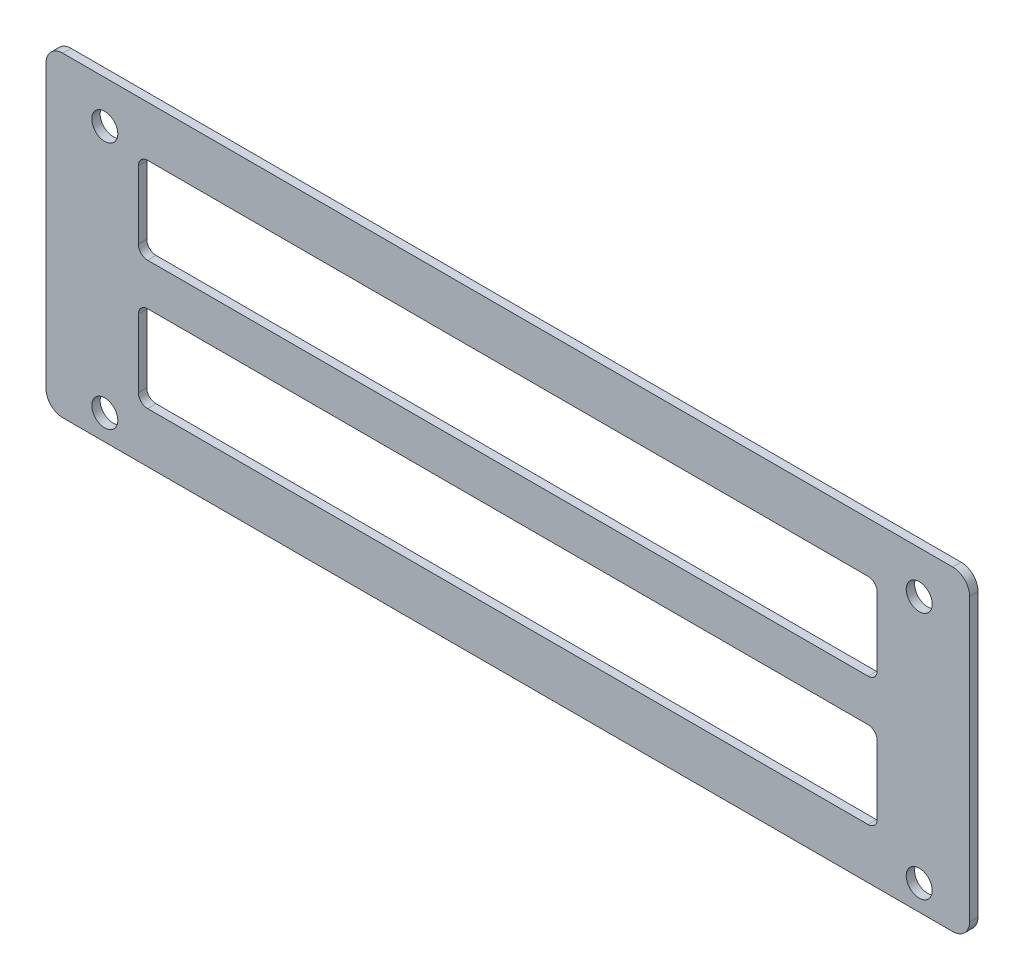
ISO-10303-21;
HEADER;
FILE_DESCRIPTION(('STEP AP214'),'2;1');
FILE_NAME('part.step','',(''),(''),'','','');
FILE_SCHEMA(('AUTOMOTIVE_DESIGN { 1 0 10303 214 1 1 1 1 }'));
ENDSEC;
DATA;
#1=APPLICATION_CONTEXT('core data for automotive mechanical design processes');
#2=APPLICATION_PROTOCOL_DEFINITION('international standard','automotive_design',2000,#1);
#3=PRODUCT_CONTEXT('',#1,'mechanical');
#4=PRODUCT('Part','Part','',(#3));
#5=PRODUCT_RELATED_PRODUCT_CATEGORY('part','',(#4));
#6=PRODUCT_DEFINITION_FORMATION('','',#4);
#7=PRODUCT_DEFINITION_CONTEXT('part definition',#1,'design');
#8=PRODUCT_DEFINITION('design','',#6,#7);
#9=PRODUCT_DEFINITION_SHAPE('','',#8);
#10=(LENGTH_UNIT() NAMED_UNIT(*) SI_UNIT(.MILLI.,.METRE.));
#11=(NAMED_UNIT(*) PLANE_ANGLE_UNIT() SI_UNIT($,.RADIAN.));
#12=(NAMED_UNIT(*) SI_UNIT($,.STERADIAN.) SOLID_ANGLE_UNIT());
#13=UNCERTAINTY_MEASURE_WITH_UNIT(LENGTH_MEASURE(1.E-05),#10,'distance_accuracy_value','');
#14=(GEOMETRIC_REPRESENTATION_CONTEXT(3) GLOBAL_UNCERTAINTY_ASSIGNED_CONTEXT((#13)) GLOBAL_UNIT_ASSIGNED_CONTEXT((#10,
#11,#12)) REPRESENTATION_CONTEXT('',''));
#15=CARTESIAN_POINT('',(0.,0.,0.));
#16=DIRECTION('',(0.,0.,1.));
#17=DIRECTION('',(1.,0.,0.));
#18=AXIS2_PLACEMENT_3D('',#15,#16,#17);
#19=CARTESIAN_POINT('',(-44.0000000000013,-12.8,-9.));
#20=DIRECTION('',(-1.,0.,0.));
#21=DIRECTION('',(0.,0.,1.));
#22=AXIS2_PLACEMENT_3D('',#19,#20,#21);
#23=PLANE('',#22);
#24=DIRECTION('',(0.,1.,0.));
#25=VECTOR('',#24,1.);
#26=CARTESIAN_POINT('',(-44.0000000000013,0.,0.));
#27=LINE('',#26,#25);
#28=CARTESIAN_POINT('',(-44.0000000000013,3.59999999999999,0.));
#29=VERTEX_POINT('',#28);
#30=CARTESIAN_POINT('',(-44.0000000000013,11.7,0.));
#31=VERTEX_POINT('',#30);
#32=EDGE_CURVE('E275',#29,#31,#27,.T.);
#33=ORIENTED_EDGE('',*,*,#32,.T.);
#34=DIRECTION('',(0.,0.,1.));
#35=VECTOR('',#34,1.);
#36=CARTESIAN_POINT('',(-44.0000000000013,11.7,1.));
#37=LINE('',#36,#35);
#38=CARTESIAN_POINT('',(-44.0000000000013,11.7,1.));
#39=VERTEX_POINT('',#38);
#40=EDGE_CURVE('E533',#31,#39,#37,.T.);
#41=ORIENTED_EDGE('',*,*,#40,.T.);
#42=DIRECTION('',(0.,-1.,0.));
#43=VECTOR('',#42,1.);
#44=CARTESIAN_POINT('',(-44.0000000000013,-12.8,1.));
#45=LINE('',#44,#43);
#46=CARTESIAN_POINT('',(-44.0000000000013,3.59999999999999,1.));
#47=VERTEX_POINT('',#46);
#48=EDGE_CURVE('E449',#39,#47,#45,.T.);
#49=ORIENTED_EDGE('',*,*,#48,.T.);
#50=DIRECTION('',(0.,0.,1.));
#51=VECTOR('',#50,1.);
#52=CARTESIAN_POINT('',(-44.0000000000013,3.59999999999999,-9.));
#53=LINE('',#52,#51);
#54=EDGE_CURVE('E536',#47,#29,#53,.F.);
#55=ORIENTED_EDGE('',*,*,#54,.T.);
#56=EDGE_LOOP('',(#33,#41,#49,#55));
#57=FACE_BOUND('',#56,.T.);
#58=ADVANCED_FACE('F39',(#57),#23,.F.);
#59=CARTESIAN_POINT('',(44.0000000000013,-12.8,-9.));
#60=DIRECTION('',(1.,0.,0.));
#61=DIRECTION('',(0.,0.,-1.));
#62=AXIS2_PLACEMENT_3D('',#59,#60,#61);
#63=PLANE('',#62);
#64=DIRECTION('',(0.,1.,0.));
#65=VECTOR('',#64,1.);
#66=CARTESIAN_POINT('',(44.0000000000013,-12.8,1.));
#67=LINE('',#66,#65);
#68=CARTESIAN_POINT('',(44.0000000000013,3.6,1.));
#69=VERTEX_POINT('',#68);
#70=CARTESIAN_POINT('',(44.0000000000013,11.7,1.));
#71=VERTEX_POINT('',#70);
#72=EDGE_CURVE('E425',#69,#71,#67,.T.);
#73=ORIENTED_EDGE('',*,*,#72,.T.);
#74=DIRECTION('',(0.,0.,1.));
#75=VECTOR('',#74,1.);
#76=CARTESIAN_POINT('',(44.0000000000013,11.7,0.));
#77=LINE('',#76,#75);
#78=CARTESIAN_POINT('',(44.0000000000013,11.7,0.));
#79=VERTEX_POINT('',#78);
#80=EDGE_CURVE('E523',#71,#79,#77,.F.);
#81=ORIENTED_EDGE('',*,*,#80,.T.);
#82=DIRECTION('',(0.,-1.,0.));
#83=VECTOR('',#82,1.);
#84=CARTESIAN_POINT('',(44.0000000000013,0.,0.));
#85=LINE('',#84,#83);
#86=CARTESIAN_POINT('',(44.0000000000013,3.6,0.));
#87=VERTEX_POINT('',#86);
#88=EDGE_CURVE('E537',#79,#87,#85,.T.);
#89=ORIENTED_EDGE('',*,*,#88,.T.);
#90=DIRECTION('',(0.,0.,1.));
#91=VECTOR('',#90,1.);
#92=CARTESIAN_POINT('',(44.0000000000013,3.6,-9.));
#93=LINE('',#92,#91);
#94=EDGE_CURVE('E525',#87,#69,#93,.T.);
#95=ORIENTED_EDGE('',*,*,#94,.T.);
#96=EDGE_LOOP('',(#73,#81,#89,#95));
#97=FACE_BOUND('',#96,.T.);
#98=ADVANCED_FACE('F351',(#97),#63,.F.);
#99=CARTESIAN_POINT('',(55.,-18.8,1.));
#100=DIRECTION('',(-1.,0.,0.));
#101=DIRECTION('',(0.,0.,1.));
#102=AXIS2_PLACEMENT_3D('',#99,#100,#101);
#103=PLANE('',#102);
#104=DIRECTION('',(0.,1.,0.));
#105=VECTOR('',#104,1.);
#106=CARTESIAN_POINT('',(55.,-18.8,1.));
#107=LINE('',#106,#105);
#108=CARTESIAN_POINT('',(55.,-16.8,1.));
#109=VERTEX_POINT('',#108);
#110=CARTESIAN_POINT('',(55.,16.8,1.));
#111=VERTEX_POINT('',#110);
#112=EDGE_CURVE('E227',#109,#111,#107,.T.);
#113=ORIENTED_EDGE('',*,*,#112,.F.);
#114=DIRECTION('',(0.,0.,-1.));
#115=VECTOR('',#114,1.);
#116=CARTESIAN_POINT('',(55.,-16.8,1.));
#117=LINE('',#116,#115);
#118=CARTESIAN_POINT('',(55.,-16.8,0.));
#119=VERTEX_POINT('',#118);
#120=EDGE_CURVE('E268',#109,#119,#117,.T.);
#121=ORIENTED_EDGE('',*,*,#120,.T.);
#122=DIRECTION('',(0.,1.,0.));
#123=VECTOR('',#122,1.);
#124=CARTESIAN_POINT('',(55.,-18.8,0.));
#125=LINE('',#124,#123);
#126=CARTESIAN_POINT('',(55.,16.8,0.));
#127=VERTEX_POINT('',#126);
#128=EDGE_CURVE('E309',#119,#127,#125,.T.);
#129=ORIENTED_EDGE('',*,*,#128,.T.);
#130=DIRECTION('',(0.,0.,-1.));
#131=VECTOR('',#130,1.);
#132=CARTESIAN_POINT('',(55.,16.8,1.));
#133=LINE('',#132,#131);
#134=EDGE_CURVE('E266',#127,#111,#133,.F.);
#135=ORIENTED_EDGE('',*,*,#134,.T.);
#136=EDGE_LOOP('',(#113,#121,#129,#135));
#137=FACE_BOUND('',#136,.T.);
#138=ADVANCED_FACE('F348',(#137),#103,.F.);
#139=CARTESIAN_POINT('',(-55.,18.8,1.));
#140=DIRECTION('',(0.,-1.,0.));
#141=DIRECTION('',(0.,0.,-1.));
#142=AXIS2_PLACEMENT_3D('',#139,#140,#141);
#143=PLANE('',#142);
#144=DIRECTION('',(-1.,0.,0.));
#145=VECTOR('',#144,1.);
#146=CARTESIAN_POINT('',(-55.,18.8,0.));
#147=LINE('',#146,#145);
#148=CARTESIAN_POINT('',(53.,18.8,0.));
#149=VERTEX_POINT('',#148);
#150=CARTESIAN_POINT('',(-53.,18.8,0.));
#151=VERTEX_POINT('',#150);
#152=EDGE_CURVE('E233',#149,#151,#147,.T.);
#153=ORIENTED_EDGE('',*,*,#152,.T.);
#154=DIRECTION('',(0.,0.,-1.));
#155=VECTOR('',#154,1.);
#156=CARTESIAN_POINT('',(-53.,18.8,1.));
#157=LINE('',#156,#155);
#158=CARTESIAN_POINT('',(-53.,18.8,1.));
#159=VERTEX_POINT('',#158);
#160=EDGE_CURVE('E264',#151,#159,#157,.F.);
#161=ORIENTED_EDGE('',*,*,#160,.T.);
#162=DIRECTION('',(-1.,0.,0.));
#163=VECTOR('',#162,1.);
#164=CARTESIAN_POINT('',(-55.,18.8,1.));
#165=LINE('',#164,#163);
#166=CARTESIAN_POINT('',(53.,18.8,1.));
#167=VERTEX_POINT('',#166);
#168=EDGE_CURVE('E231',#167,#159,#165,.T.);
#169=ORIENTED_EDGE('',*,*,#168,.F.);
#170=DIRECTION('',(0.,0.,-1.));
#171=VECTOR('',#170,1.);
#172=CARTESIAN_POINT('',(53.,18.8,1.));
#173=LINE('',#172,#171);
#174=EDGE_CURVE('E261',#167,#149,#173,.T.);
#175=ORIENTED_EDGE('',*,*,#174,.T.);
#176=EDGE_LOOP('',(#153,#161,#169,#175));
#177=FACE_BOUND('',#176,.T.);
#178=ADVANCED_FACE('F331',(#177),#143,.F.);
#179=CARTESIAN_POINT('',(-55.,-18.8,1.));
#180=DIRECTION('',(1.,0.,0.));
#181=DIRECTION('',(0.,0.,-1.));
#182=AXIS2_PLACEMENT_3D('',#179,#180,#181);
#183=PLANE('',#182);
#184=DIRECTION('',(0.,-1.,0.));
#185=VECTOR('',#184,1.);
#186=CARTESIAN_POINT('',(-55.,-18.8,0.));
#187=LINE('',#186,#185);
#188=CARTESIAN_POINT('',(-55.,16.8,0.));
#189=VERTEX_POINT('',#188);
#190=CARTESIAN_POINT('',(-55.,-16.8,0.));
#191=VERTEX_POINT('',#190);
#192=EDGE_CURVE('E228',#189,#191,#187,.T.);
#193=ORIENTED_EDGE('',*,*,#192,.T.);
#194=DIRECTION('',(0.,0.,-1.));
#195=VECTOR('',#194,1.);
#196=CARTESIAN_POINT('',(-55.,-16.8,1.));
#197=LINE('',#196,#195);
#198=CARTESIAN_POINT('',(-55.,-16.8,1.));
#199=VERTEX_POINT('',#198);
#200=EDGE_CURVE('E205',#191,#199,#197,.F.);
#201=ORIENTED_EDGE('',*,*,#200,.T.);
#202=DIRECTION('',(0.,-1.,0.));
#203=VECTOR('',#202,1.);
#204=CARTESIAN_POINT('',(-55.,-18.8,1.));
#205=LINE('',#204,#203);
#206=CARTESIAN_POINT('',(-55.,16.8,1.));
#207=VERTEX_POINT('',#206);
#208=EDGE_CURVE('E313',#207,#199,#205,.T.);
#209=ORIENTED_EDGE('',*,*,#208,.F.);
#210=DIRECTION('',(0.,0.,-1.));
#211=VECTOR('',#210,1.);
#212=CARTESIAN_POINT('',(-55.,16.8,1.));
#213=LINE('',#212,#211);
#214=EDGE_CURVE('E210',#207,#189,#213,.T.);
#215=ORIENTED_EDGE('',*,*,#214,.T.);
#216=EDGE_LOOP('',(#193,#201,#209,#215));
#217=FACE_BOUND('',#216,.T.);
#218=ADVANCED_FACE('F340',(#217),#183,.F.);
#219=CARTESIAN_POINT('',(-55.,-18.8,1.));
#220=DIRECTION('',(0.,1.,0.));
#221=DIRECTION('',(0.,0.,1.));
#222=AXIS2_PLACEMENT_3D('',#219,#220,#221);
#223=PLANE('',#222);
#224=DIRECTION('',(1.,0.,0.));
#225=VECTOR('',#224,1.);
#226=CARTESIAN_POINT('',(-55.,-18.8,1.));
#227=LINE('',#226,#225);
#228=CARTESIAN_POINT('',(-53.,-18.8,1.));
#229=VERTEX_POINT('',#228);
#230=CARTESIAN_POINT('',(53.,-18.8,1.));
#231=VERTEX_POINT('',#230);
#232=EDGE_CURVE('E220',#229,#231,#227,.T.);
#233=ORIENTED_EDGE('',*,*,#232,.F.);
#234=DIRECTION('',(0.,0.,-1.));
#235=VECTOR('',#234,1.);
#236=CARTESIAN_POINT('',(-53.,-18.8,1.));
#237=LINE('',#236,#235);
#238=CARTESIAN_POINT('',(-53.,-18.8,0.));
#239=VERTEX_POINT('',#238);
#240=EDGE_CURVE('E204',#229,#239,#237,.T.);
#241=ORIENTED_EDGE('',*,*,#240,.T.);
#242=DIRECTION('',(1.,0.,0.));
#243=VECTOR('',#242,1.);
#244=CARTESIAN_POINT('',(-55.,-18.8,0.));
#245=LINE('',#244,#243);
#246=CARTESIAN_POINT('',(53.,-18.8,0.));
#247=VERTEX_POINT('',#246);
#248=EDGE_CURVE('E217',#239,#247,#245,.T.);
#249=ORIENTED_EDGE('',*,*,#248,.T.);
#250=DIRECTION('',(0.,0.,-1.));
#251=VECTOR('',#250,1.);
#252=CARTESIAN_POINT('',(53.,-18.8,1.));
#253=LINE('',#252,#251);
#254=EDGE_CURVE('E222',#247,#231,#253,.F.);
#255=ORIENTED_EDGE('',*,*,#254,.T.);
#256=EDGE_LOOP('',(#233,#241,#249,#255));
#257=FACE_BOUND('',#256,.T.);
#258=ADVANCED_FACE('F216',(#257),#223,.F.);
#259=CARTESIAN_POINT('',(0.,0.,1.));
#260=DIRECTION('',(0.,0.,-1.));
#261=DIRECTION('',(-1.,0.,0.));
#262=AXIS2_PLACEMENT_3D('',#259,#260,#261);
#263=PLANE('',#262);
#264=CARTESIAN_POINT('',(-44.0000000000013,-3.59999999999999,1.));
#265=VERTEX_POINT('',#264);
#266=CARTESIAN_POINT('',(-44.0000000000013,-11.7,1.));
#267=VERTEX_POINT('',#266);
#268=EDGE_CURVE('E450',#265,#267,#45,.T.);
#269=ORIENTED_EDGE('',*,*,#268,.F.);
#270=CARTESIAN_POINT('',(-42.9000000000013,-3.59999999999999,1.));
#271=DIRECTION('',(0.,0.,-1.));
#272=DIRECTION('',(-1.,0.,0.));
#273=AXIS2_PLACEMENT_3D('',#270,#271,#272);
#274=CIRCLE('',#273,1.1);
#275=CARTESIAN_POINT('',(-42.9000000000013,-2.49999999999999,1.));
#276=VERTEX_POINT('',#275);
#277=EDGE_CURVE('E61',#265,#276,#274,.T.);
#278=ORIENTED_EDGE('',*,*,#277,.T.);
#279=DIRECTION('',(1.,0.,0.));
#280=VECTOR('',#279,1.);
#281=CARTESIAN_POINT('',(-44.0000000000013,-2.49999999999999,1.));
#282=LINE('',#281,#280);
#283=CARTESIAN_POINT('',(42.9000000000013,-2.5,1.));
#284=VERTEX_POINT('',#283);
#285=EDGE_CURVE('E432',#276,#284,#282,.T.);
#286=ORIENTED_EDGE('',*,*,#285,.T.);
#287=CARTESIAN_POINT('',(42.9000000000013,-3.6,1.));
#288=DIRECTION('',(0.,0.,-1.));
#289=DIRECTION('',(-1.,0.,0.));
#290=AXIS2_PLACEMENT_3D('',#287,#288,#289);
#291=CIRCLE('',#290,1.1);
#292=CARTESIAN_POINT('',(44.0000000000013,-3.6,1.));
#293=VERTEX_POINT('',#292);
#294=EDGE_CURVE('E407',#284,#293,#291,.T.);
#295=ORIENTED_EDGE('',*,*,#294,.T.);
#296=CARTESIAN_POINT('',(44.0000000000013,-11.7,1.));
#297=VERTEX_POINT('',#296);
#298=EDGE_CURVE('E429',#297,#293,#67,.T.);
#299=ORIENTED_EDGE('',*,*,#298,.F.);
#300=CARTESIAN_POINT('',(42.9000000000013,-11.7,1.));
#301=DIRECTION('',(0.,0.,-1.));
#302=DIRECTION('',(-1.,0.,0.));
#303=AXIS2_PLACEMENT_3D('',#300,#301,#302);
#304=CIRCLE('',#303,1.1);
#305=CARTESIAN_POINT('',(42.9000000000013,-12.8,1.));
#306=VERTEX_POINT('',#305);
#307=EDGE_CURVE('E411',#297,#306,#304,.T.);
#308=ORIENTED_EDGE('',*,*,#307,.T.);
#309=DIRECTION('',(-1.,0.,0.));
#310=VECTOR('',#309,1.);
#311=CARTESIAN_POINT('',(0.,-12.8,1.));
#312=LINE('',#311,#310);
#313=CARTESIAN_POINT('',(-42.9000000000013,-12.8,1.));
#314=VERTEX_POINT('',#313);
#315=EDGE_CURVE('E290',#306,#314,#312,.T.);
#316=ORIENTED_EDGE('',*,*,#315,.T.);
#317=CARTESIAN_POINT('',(-42.9000000000013,-11.7,0.999999999999999));
#318=DIRECTION('',(0.,0.,-1.));
#319=DIRECTION('',(-1.,0.,0.));
#320=AXIS2_PLACEMENT_3D('',#317,#318,#319);
#321=CIRCLE('',#320,1.1);
#322=EDGE_CURVE('E47',#314,#267,#321,.T.);
#323=ORIENTED_EDGE('',*,*,#322,.T.);
#324=EDGE_LOOP('',(#269,#278,#286,#295,#299,#308,#316,#323));
#325=FACE_BOUND('',#324,.T.);
#326=ORIENTED_EDGE('',*,*,#72,.F.);
#327=CARTESIAN_POINT('',(42.9000000000013,3.6,1.));
#328=DIRECTION('',(0.,0.,-1.));
#329=DIRECTION('',(-1.,0.,0.));
#330=AXIS2_PLACEMENT_3D('',#327,#328,#329);
#331=CIRCLE('',#330,1.1);
#332=CARTESIAN_POINT('',(42.9000000000013,2.5,1.));
#333=VERTEX_POINT('',#332);
#334=EDGE_CURVE('E399',#69,#333,#331,.T.);
#335=ORIENTED_EDGE('',*,*,#334,.T.);
#336=DIRECTION('',(-1.,0.,0.));
#337=VECTOR('',#336,1.);
#338=CARTESIAN_POINT('',(-44.0000000000013,2.49999999999999,1.));
#339=LINE('',#338,#337);
#340=CARTESIAN_POINT('',(-42.9000000000013,2.49999999999999,1.));
#341=VERTEX_POINT('',#340);
#342=EDGE_CURVE('E554',#333,#341,#339,.T.);
#343=ORIENTED_EDGE('',*,*,#342,.T.);
#344=CARTESIAN_POINT('',(-42.9000000000013,3.59999999999999,1.));
#345=DIRECTION('',(0.,0.,-1.));
#346=DIRECTION('',(-1.,0.,0.));
#347=AXIS2_PLACEMENT_3D('',#344,#345,#346);
#348=CIRCLE('',#347,1.1);
#349=EDGE_CURVE('E403',#341,#47,#348,.T.);
#350=ORIENTED_EDGE('',*,*,#349,.T.);
#351=ORIENTED_EDGE('',*,*,#48,.F.);
#352=CARTESIAN_POINT('',(-42.9000000000013,11.7,1.));
#353=DIRECTION('',(0.,0.,-1.));
#354=DIRECTION('',(-1.,0.,0.));
#355=AXIS2_PLACEMENT_3D('',#352,#353,#354);
#356=CIRCLE('',#355,1.1);
#357=CARTESIAN_POINT('',(-42.9000000000013,12.8,1.));
#358=VERTEX_POINT('',#357);
#359=EDGE_CURVE('E386',#39,#358,#356,.T.);
#360=ORIENTED_EDGE('',*,*,#359,.T.);
#361=DIRECTION('',(-1.,0.,0.));
#362=VECTOR('',#361,1.);
#363=CARTESIAN_POINT('',(-44.0000000000013,12.8,1.));
#364=LINE('',#363,#362);
#365=CARTESIAN_POINT('',(42.9000000000013,12.8,1.));
#366=VERTEX_POINT('',#365);
#367=EDGE_CURVE('E827',#366,#358,#364,.T.);
#368=ORIENTED_EDGE('',*,*,#367,.F.);
#369=CARTESIAN_POINT('',(42.9000000000013,11.7,1.));
#370=DIRECTION('',(0.,0.,-1.));
#371=DIRECTION('',(-1.,0.,0.));
#372=AXIS2_PLACEMENT_3D('',#369,#370,#371);
#373=CIRCLE('',#372,1.1);
#374=EDGE_CURVE('E395',#366,#71,#373,.T.);
#375=ORIENTED_EDGE('',*,*,#374,.T.);
#376=EDGE_LOOP('',(#326,#335,#343,#350,#351,#360,#368,#375));
#377=FACE_BOUND('',#376,.T.);
#378=CARTESIAN_POINT('',(49.0000000000007,13.7500000000026,0.999999999999999));
#379=DIRECTION('',(0.,0.,-1.));
#380=DIRECTION('',(-1.,0.,0.));
#381=AXIS2_PLACEMENT_3D('',#378,#379,#380);
#382=CIRCLE('',#381,1.55);
#383=CARTESIAN_POINT('',(47.4500000000007,13.7500000000026,0.999999999999999));
#384=VERTEX_POINT('',#383);
#385=EDGE_CURVE('E307',#384,#384,#382,.T.);
#386=ORIENTED_EDGE('',*,*,#385,.T.);
#387=EDGE_LOOP('',(#386));
#388=FACE_BOUND('',#387,.T.);
#389=CARTESIAN_POINT('',(49.,-15.8,0.999999999999999));
#390=DIRECTION('',(0.,0.,-1.));
#391=DIRECTION('',(-1.,0.,0.));
#392=AXIS2_PLACEMENT_3D('',#389,#390,#391);
#393=CIRCLE('',#392,1.55);
#394=CARTESIAN_POINT('',(47.45,-15.8,0.999999999999999));
#395=VERTEX_POINT('',#394);
#396=EDGE_CURVE('E304',#395,#395,#393,.T.);
#397=ORIENTED_EDGE('',*,*,#396,.T.);
#398=EDGE_LOOP('',(#397));
#399=FACE_BOUND('',#398,.T.);
#400=CARTESIAN_POINT('',(-48.0000000000001,-15.8,0.999999999999999));
#401=DIRECTION('',(0.,0.,-1.));
#402=DIRECTION('',(-1.,0.,0.));
#403=AXIS2_PLACEMENT_3D('',#400,#401,#402);
#404=CIRCLE('',#403,1.55);
#405=CARTESIAN_POINT('',(-49.5500000000001,-15.8,0.999999999999999));
#406=VERTEX_POINT('',#405);
#407=EDGE_CURVE('E301',#406,#406,#404,.T.);
#408=ORIENTED_EDGE('',*,*,#407,.T.);
#409=EDGE_LOOP('',(#408));
#410=FACE_BOUND('',#409,.T.);
#411=CARTESIAN_POINT('',(-48.0000000000004,13.7499999999985,0.999999999999999));
#412=DIRECTION('',(0.,0.,-1.));
#413=DIRECTION('',(-1.,0.,0.));
#414=AXIS2_PLACEMENT_3D('',#411,#412,#413);
#415=CIRCLE('',#414,1.55);
#416=CARTESIAN_POINT('',(-49.5500000000004,13.7499999999985,0.999999999999999));
#417=VERTEX_POINT('',#416);
#418=EDGE_CURVE('E297',#417,#417,#415,.T.);
#419=ORIENTED_EDGE('',*,*,#418,.T.);
#420=EDGE_LOOP('',(#419));
#421=FACE_BOUND('',#420,.T.);
#422=ORIENTED_EDGE('',*,*,#208,.T.);
#423=CARTESIAN_POINT('',(-53.,-16.8,1.));
#424=DIRECTION('',(0.,0.,-1.));
#425=DIRECTION('',(-1.,0.,0.));
#426=AXIS2_PLACEMENT_3D('',#423,#424,#425);
#427=CIRCLE('',#426,2.);
#428=EDGE_CURVE('E259',#199,#229,#427,.F.);
#429=ORIENTED_EDGE('',*,*,#428,.T.);
#430=ORIENTED_EDGE('',*,*,#232,.T.);
#431=CARTESIAN_POINT('',(53.,-16.8,1.));
#432=DIRECTION('',(0.,0.,-1.));
#433=DIRECTION('',(-1.,0.,0.));
#434=AXIS2_PLACEMENT_3D('',#431,#432,#433);
#435=CIRCLE('',#434,2.);
#436=EDGE_CURVE('E255',#231,#109,#435,.F.);
#437=ORIENTED_EDGE('',*,*,#436,.T.);
#438=ORIENTED_EDGE('',*,*,#112,.T.);
#439=CARTESIAN_POINT('',(53.,16.8,1.));
#440=DIRECTION('',(0.,0.,-1.));
#441=DIRECTION('',(-1.,0.,0.));
#442=AXIS2_PLACEMENT_3D('',#439,#440,#441);
#443=CIRCLE('',#442,2.);
#444=EDGE_CURVE('E253',#111,#167,#443,.F.);
#445=ORIENTED_EDGE('',*,*,#444,.T.);
#446=ORIENTED_EDGE('',*,*,#168,.T.);
#447=CARTESIAN_POINT('',(-53.,16.8,1.));
#448=DIRECTION('',(0.,0.,-1.));
#449=DIRECTION('',(-1.,0.,0.));
#450=AXIS2_PLACEMENT_3D('',#447,#448,#449);
#451=CIRCLE('',#450,2.);
#452=EDGE_CURVE('E257',#159,#207,#451,.F.);
#453=ORIENTED_EDGE('',*,*,#452,.T.);
#454=EDGE_LOOP('',(#422,#429,#430,#437,#438,#445,#446,#453));
#455=FACE_BOUND('',#454,.T.);
#456=ADVANCED_FACE('F338',(#325,#377,#388,#399,#410,#421,#455),#263,.F.);
#457=CARTESIAN_POINT('',(0.,0.,0.));
#458=DIRECTION('',(0.,0.,-1.));
#459=DIRECTION('',(-1.,0.,0.));
#460=AXIS2_PLACEMENT_3D('',#457,#458,#459);
#461=PLANE('',#460);
#462=DIRECTION('',(1.,0.,0.));
#463=VECTOR('',#462,1.);
#464=CARTESIAN_POINT('',(-44.0000000000013,-2.49999999999999,0.));
#465=LINE('',#464,#463);
#466=CARTESIAN_POINT('',(-42.9000000000013,-2.49999999999999,0.));
#467=VERTEX_POINT('',#466);
#468=CARTESIAN_POINT('',(42.9000000000013,-2.5,0.));
#469=VERTEX_POINT('',#468);
#470=EDGE_CURVE('E419',#467,#469,#465,.T.);
#471=ORIENTED_EDGE('',*,*,#470,.F.);
#472=CARTESIAN_POINT('',(-42.9000000000013,-3.59999999999999,0.));
#473=DIRECTION('',(0.,0.,-1.));
#474=DIRECTION('',(-1.,0.,0.));
#475=AXIS2_PLACEMENT_3D('',#472,#473,#474);
#476=CIRCLE('',#475,1.1);
#477=CARTESIAN_POINT('',(-44.0000000000013,-3.59999999999999,0.));
#478=VERTEX_POINT('',#477);
#479=EDGE_CURVE('E385',#467,#478,#476,.F.);
#480=ORIENTED_EDGE('',*,*,#479,.T.);
#481=CARTESIAN_POINT('',(-44.0000000000013,-11.7,0.));
#482=VERTEX_POINT('',#481);
#483=EDGE_CURVE('E276',#482,#478,#27,.T.);
#484=ORIENTED_EDGE('',*,*,#483,.F.);
#485=CARTESIAN_POINT('',(-42.9000000000013,-11.7,0.));
#486=DIRECTION('',(0.,0.,-1.));
#487=DIRECTION('',(-1.,0.,0.));
#488=AXIS2_PLACEMENT_3D('',#485,#486,#487);
#489=CIRCLE('',#488,1.1);
#490=CARTESIAN_POINT('',(-42.9000000000013,-12.8,0.));
#491=VERTEX_POINT('',#490);
#492=EDGE_CURVE('E12',#482,#491,#489,.F.);
#493=ORIENTED_EDGE('',*,*,#492,.T.);
#494=DIRECTION('',(-1.,0.,0.));
#495=VECTOR('',#494,1.);
#496=CARTESIAN_POINT('',(19.0945158430798,-12.8,0.));
#497=LINE('',#496,#495);
#498=CARTESIAN_POINT('',(42.9000000000013,-12.8,0.));
#499=VERTEX_POINT('',#498);
#500=EDGE_CURVE('E444',#499,#491,#497,.T.);
#501=ORIENTED_EDGE('',*,*,#500,.F.);
#502=CARTESIAN_POINT('',(42.9000000000013,-11.7,0.));
#503=DIRECTION('',(0.,0.,-1.));
#504=DIRECTION('',(-1.,0.,0.));
#505=AXIS2_PLACEMENT_3D('',#502,#503,#504);
#506=CIRCLE('',#505,1.1);
#507=CARTESIAN_POINT('',(44.0000000000013,-11.7,0.));
#508=VERTEX_POINT('',#507);
#509=EDGE_CURVE('E413',#499,#508,#506,.F.);
#510=ORIENTED_EDGE('',*,*,#509,.T.);
#511=CARTESIAN_POINT('',(44.0000000000013,-3.6,0.));
#512=VERTEX_POINT('',#511);
#513=EDGE_CURVE('E382',#512,#508,#85,.T.);
#514=ORIENTED_EDGE('',*,*,#513,.F.);
#515=CARTESIAN_POINT('',(42.9000000000013,-3.6,0.));
#516=DIRECTION('',(0.,0.,-1.));
#517=DIRECTION('',(-1.,0.,0.));
#518=AXIS2_PLACEMENT_3D('',#515,#516,#517);
#519=CIRCLE('',#518,1.1);
#520=EDGE_CURVE('E409',#512,#469,#519,.F.);
#521=ORIENTED_EDGE('',*,*,#520,.T.);
#522=EDGE_LOOP('',(#471,#480,#484,#493,#501,#510,#514,#521));
#523=FACE_BOUND('',#522,.T.);
#524=ORIENTED_EDGE('',*,*,#32,.F.);
#525=CARTESIAN_POINT('',(-42.9000000000013,3.59999999999999,0.));
#526=DIRECTION('',(0.,0.,-1.));
#527=DIRECTION('',(-1.,0.,0.));
#528=AXIS2_PLACEMENT_3D('',#525,#526,#527);
#529=CIRCLE('',#528,1.1);
#530=CARTESIAN_POINT('',(-42.9000000000013,2.49999999999999,0.));
#531=VERTEX_POINT('',#530);
#532=EDGE_CURVE('E405',#29,#531,#529,.F.);
#533=ORIENTED_EDGE('',*,*,#532,.T.);
#534=DIRECTION('',(-1.,0.,0.));
#535=VECTOR('',#534,1.);
#536=CARTESIAN_POINT('',(-44.0000000000013,2.49999999999999,0.));
#537=LINE('',#536,#535);
#538=CARTESIAN_POINT('',(42.9000000000013,2.5,0.));
#539=VERTEX_POINT('',#538);
#540=EDGE_CURVE('E426',#539,#531,#537,.T.);
#541=ORIENTED_EDGE('',*,*,#540,.F.);
#542=CARTESIAN_POINT('',(42.9000000000013,3.6,0.));
#543=DIRECTION('',(0.,0.,-1.));
#544=DIRECTION('',(-1.,0.,0.));
#545=AXIS2_PLACEMENT_3D('',#542,#543,#544);
#546=CIRCLE('',#545,1.1);
#547=EDGE_CURVE('E401',#539,#87,#546,.F.);
#548=ORIENTED_EDGE('',*,*,#547,.T.);
#549=ORIENTED_EDGE('',*,*,#88,.F.);
#550=CARTESIAN_POINT('',(42.9000000000013,11.7,0.));
#551=DIRECTION('',(0.,0.,-1.));
#552=DIRECTION('',(-1.,0.,0.));
#553=AXIS2_PLACEMENT_3D('',#550,#551,#552);
#554=CIRCLE('',#553,1.1);
#555=CARTESIAN_POINT('',(42.9000000000013,12.8,0.));
#556=VERTEX_POINT('',#555);
#557=EDGE_CURVE('E397',#79,#556,#554,.F.);
#558=ORIENTED_EDGE('',*,*,#557,.T.);
#559=DIRECTION('',(1.,0.,0.));
#560=VECTOR('',#559,1.);
#561=CARTESIAN_POINT('',(0.,12.8,0.));
#562=LINE('',#561,#560);
#563=CARTESIAN_POINT('',(-42.9000000000013,12.8,0.));
#564=VERTEX_POINT('',#563);
#565=EDGE_CURVE('E271',#564,#556,#562,.T.);
#566=ORIENTED_EDGE('',*,*,#565,.F.);
#567=CARTESIAN_POINT('',(-42.9000000000013,11.7,0.));
#568=DIRECTION('',(0.,0.,-1.));
#569=DIRECTION('',(-1.,0.,0.));
#570=AXIS2_PLACEMENT_3D('',#567,#568,#569);
#571=CIRCLE('',#570,1.1);
#572=EDGE_CURVE('E388',#564,#31,#571,.F.);
#573=ORIENTED_EDGE('',*,*,#572,.T.);
#574=EDGE_LOOP('',(#524,#533,#541,#548,#549,#558,#566,#573));
#575=FACE_BOUND('',#574,.T.);
#576=CARTESIAN_POINT('',(49.0000000000007,13.7500000000026,0.));
#577=DIRECTION('',(0.,0.,-1.));
#578=DIRECTION('',(-1.,0.,0.));
#579=AXIS2_PLACEMENT_3D('',#576,#577,#578);
#580=CIRCLE('',#579,1.55);
#581=CARTESIAN_POINT('',(47.4500000000007,13.7500000000026,0.));
#582=VERTEX_POINT('',#581);
#583=EDGE_CURVE('E286',#582,#582,#580,.T.);
#584=ORIENTED_EDGE('',*,*,#583,.F.);
#585=EDGE_LOOP('',(#584));
#586=FACE_BOUND('',#585,.T.);
#587=CARTESIAN_POINT('',(49.,-15.8,0.));
#588=DIRECTION('',(0.,0.,-1.));
#589=DIRECTION('',(-1.,0.,0.));
#590=AXIS2_PLACEMENT_3D('',#587,#588,#589);
#591=CIRCLE('',#590,1.55);
#592=CARTESIAN_POINT('',(47.45,-15.8,0.));
#593=VERTEX_POINT('',#592);
#594=EDGE_CURVE('E289',#593,#593,#591,.T.);
#595=ORIENTED_EDGE('',*,*,#594,.F.);
#596=EDGE_LOOP('',(#595));
#597=FACE_BOUND('',#596,.T.);
#598=CARTESIAN_POINT('',(-48.0000000000001,-15.8,0.));
#599=DIRECTION('',(0.,0.,-1.));
#600=DIRECTION('',(-1.,0.,0.));
#601=AXIS2_PLACEMENT_3D('',#598,#599,#600);
#602=CIRCLE('',#601,1.55);
#603=CARTESIAN_POINT('',(-49.5500000000001,-15.8,0.));
#604=VERTEX_POINT('',#603);
#605=EDGE_CURVE('E298',#604,#604,#602,.T.);
#606=ORIENTED_EDGE('',*,*,#605,.F.);
#607=EDGE_LOOP('',(#606));
#608=FACE_BOUND('',#607,.T.);
#609=CARTESIAN_POINT('',(-48.0000000000004,13.7499999999985,0.));
#610=DIRECTION('',(0.,0.,-1.));
#611=DIRECTION('',(-1.,0.,0.));
#612=AXIS2_PLACEMENT_3D('',#609,#610,#611);
#613=CIRCLE('',#612,1.55);
#614=CARTESIAN_POINT('',(-49.5500000000004,13.7499999999985,0.));
#615=VERTEX_POINT('',#614);
#616=EDGE_CURVE('E293',#615,#615,#613,.T.);
#617=ORIENTED_EDGE('',*,*,#616,.F.);
#618=EDGE_LOOP('',(#617));
#619=FACE_BOUND('',#618,.T.);
#620=ORIENTED_EDGE('',*,*,#248,.F.);
#621=CARTESIAN_POINT('',(-53.,-16.8,0.));
#622=DIRECTION('',(0.,0.,-1.));
#623=DIRECTION('',(-1.,0.,0.));
#624=AXIS2_PLACEMENT_3D('',#621,#622,#623);
#625=CIRCLE('',#624,2.);
#626=EDGE_CURVE('E200',#239,#191,#625,.T.);
#627=ORIENTED_EDGE('',*,*,#626,.T.);
#628=ORIENTED_EDGE('',*,*,#192,.F.);
#629=CARTESIAN_POINT('',(-53.,16.8,0.));
#630=DIRECTION('',(0.,0.,-1.));
#631=DIRECTION('',(-1.,0.,0.));
#632=AXIS2_PLACEMENT_3D('',#629,#630,#631);
#633=CIRCLE('',#632,2.);
#634=EDGE_CURVE('E211',#189,#151,#633,.T.);
#635=ORIENTED_EDGE('',*,*,#634,.T.);
#636=ORIENTED_EDGE('',*,*,#152,.F.);
#637=CARTESIAN_POINT('',(53.,16.8,0.));
#638=DIRECTION('',(0.,0.,-1.));
#639=DIRECTION('',(-1.,0.,0.));
#640=AXIS2_PLACEMENT_3D('',#637,#638,#639);
#641=CIRCLE('',#640,2.);
#642=EDGE_CURVE('E221',#149,#127,#641,.T.);
#643=ORIENTED_EDGE('',*,*,#642,.T.);
#644=ORIENTED_EDGE('',*,*,#128,.F.);
#645=CARTESIAN_POINT('',(53.,-16.8,0.));
#646=DIRECTION('',(0.,0.,-1.));
#647=DIRECTION('',(-1.,0.,0.));
#648=AXIS2_PLACEMENT_3D('',#645,#646,#647);
#649=CIRCLE('',#648,2.);
#650=EDGE_CURVE('E226',#119,#247,#649,.T.);
#651=ORIENTED_EDGE('',*,*,#650,.T.);
#652=EDGE_LOOP('',(#620,#627,#628,#635,#636,#643,#644,#651));
#653=FACE_BOUND('',#652,.T.);
#654=ADVANCED_FACE('F224',(#523,#575,#586,#597,#608,#619,#653),#461,.T.);
#655=CARTESIAN_POINT('',(-48.0000000000004,13.7499999999985,10.));
#656=DIRECTION('',(0.,0.,-1.));
#657=DIRECTION('',(-1.,0.,0.));
#658=AXIS2_PLACEMENT_3D('',#655,#656,#657);
#659=CYLINDRICAL_SURFACE('',#658,1.55);
#660=ORIENTED_EDGE('',*,*,#616,.T.);
#661=EDGE_LOOP('',(#660));
#662=FACE_BOUND('',#661,.T.);
#663=ORIENTED_EDGE('',*,*,#418,.F.);
#664=EDGE_LOOP('',(#663));
#665=FACE_BOUND('',#664,.T.);
#666=ADVANCED_FACE('F463',(#662,#665),#659,.F.);
#667=CARTESIAN_POINT('',(-48.0000000000001,-15.8,10.));
#668=DIRECTION('',(0.,0.,-1.));
#669=DIRECTION('',(-1.,0.,0.));
#670=AXIS2_PLACEMENT_3D('',#667,#668,#669);
#671=CYLINDRICAL_SURFACE('',#670,1.55);
#672=ORIENTED_EDGE('',*,*,#605,.T.);
#673=EDGE_LOOP('',(#672));
#674=FACE_BOUND('',#673,.T.);
#675=ORIENTED_EDGE('',*,*,#407,.F.);
#676=EDGE_LOOP('',(#675));
#677=FACE_BOUND('',#676,.T.);
#678=ADVANCED_FACE('F470',(#674,#677),#671,.F.);
#679=CARTESIAN_POINT('',(49.,-15.8,10.));
#680=DIRECTION('',(0.,0.,-1.));
#681=DIRECTION('',(-1.,0.,0.));
#682=AXIS2_PLACEMENT_3D('',#679,#680,#681);
#683=CYLINDRICAL_SURFACE('',#682,1.55);
#684=ORIENTED_EDGE('',*,*,#594,.T.);
#685=EDGE_LOOP('',(#684));
#686=FACE_BOUND('',#685,.T.);
#687=ORIENTED_EDGE('',*,*,#396,.F.);
#688=EDGE_LOOP('',(#687));
#689=FACE_BOUND('',#688,.T.);
#690=ADVANCED_FACE('F458',(#686,#689),#683,.F.);
#691=CARTESIAN_POINT('',(49.0000000000007,13.7500000000026,10.));
#692=DIRECTION('',(0.,0.,-1.));
#693=DIRECTION('',(-1.,0.,0.));
#694=AXIS2_PLACEMENT_3D('',#691,#692,#693);
#695=CYLINDRICAL_SURFACE('',#694,1.55);
#696=ORIENTED_EDGE('',*,*,#583,.T.);
#697=EDGE_LOOP('',(#696));
#698=FACE_BOUND('',#697,.T.);
#699=ORIENTED_EDGE('',*,*,#385,.F.);
#700=EDGE_LOOP('',(#699));
#701=FACE_BOUND('',#700,.T.);
#702=ADVANCED_FACE('F480',(#698,#701),#695,.F.);
#703=CARTESIAN_POINT('',(-53.,-16.8,1.));
#704=DIRECTION('',(0.,0.,-1.));
#705=DIRECTION('',(-1.,0.,0.));
#706=AXIS2_PLACEMENT_3D('',#703,#704,#705);
#707=CYLINDRICAL_SURFACE('',#706,2.);
#708=ORIENTED_EDGE('',*,*,#428,.F.);
#709=ORIENTED_EDGE('',*,*,#200,.F.);
#710=ORIENTED_EDGE('',*,*,#626,.F.);
#711=ORIENTED_EDGE('',*,*,#240,.F.);
#712=EDGE_LOOP('',(#708,#709,#710,#711));
#713=FACE_BOUND('',#712,.T.);
#714=ADVANCED_FACE('F203',(#713),#707,.T.);
#715=CARTESIAN_POINT('',(-53.,16.8,1.));
#716=DIRECTION('',(0.,0.,-1.));
#717=DIRECTION('',(-1.,0.,0.));
#718=AXIS2_PLACEMENT_3D('',#715,#716,#717);
#719=CYLINDRICAL_SURFACE('',#718,2.);
#720=ORIENTED_EDGE('',*,*,#452,.F.);
#721=ORIENTED_EDGE('',*,*,#160,.F.);
#722=ORIENTED_EDGE('',*,*,#634,.F.);
#723=ORIENTED_EDGE('',*,*,#214,.F.);
#724=EDGE_LOOP('',(#720,#721,#722,#723));
#725=FACE_BOUND('',#724,.T.);
#726=ADVANCED_FACE('F335',(#725),#719,.T.);
#727=CARTESIAN_POINT('',(53.,-16.8,1.));
#728=DIRECTION('',(0.,0.,-1.));
#729=DIRECTION('',(-1.,0.,0.));
#730=AXIS2_PLACEMENT_3D('',#727,#728,#729);
#731=CYLINDRICAL_SURFACE('',#730,2.);
#732=ORIENTED_EDGE('',*,*,#436,.F.);
#733=ORIENTED_EDGE('',*,*,#254,.F.);
#734=ORIENTED_EDGE('',*,*,#650,.F.);
#735=ORIENTED_EDGE('',*,*,#120,.F.);
#736=EDGE_LOOP('',(#732,#733,#734,#735));
#737=FACE_BOUND('',#736,.T.);
#738=ADVANCED_FACE('F494',(#737),#731,.T.);
#739=CARTESIAN_POINT('',(53.,16.8,1.));
#740=DIRECTION('',(0.,0.,-1.));
#741=DIRECTION('',(-1.,0.,0.));
#742=AXIS2_PLACEMENT_3D('',#739,#740,#741);
#743=CYLINDRICAL_SURFACE('',#742,2.);
#744=ORIENTED_EDGE('',*,*,#444,.F.);
#745=ORIENTED_EDGE('',*,*,#134,.F.);
#746=ORIENTED_EDGE('',*,*,#642,.F.);
#747=ORIENTED_EDGE('',*,*,#174,.F.);
#748=EDGE_LOOP('',(#744,#745,#746,#747));
#749=FACE_BOUND('',#748,.T.);
#750=ADVANCED_FACE('F489',(#749),#743,.T.);
#751=CARTESIAN_POINT('',(19.0945158430798,-12.8,10.));
#752=DIRECTION('',(0.,-1.,0.));
#753=DIRECTION('',(0.,0.,-1.));
#754=AXIS2_PLACEMENT_3D('',#751,#752,#753);
#755=PLANE('',#754);
#756=ORIENTED_EDGE('',*,*,#315,.F.);
#757=DIRECTION('',(0.,0.,1.));
#758=VECTOR('',#757,1.);
#759=CARTESIAN_POINT('',(42.9000000000013,-12.8,0.));
#760=LINE('',#759,#758);
#761=EDGE_CURVE('E390',#306,#499,#760,.F.);
#762=ORIENTED_EDGE('',*,*,#761,.T.);
#763=ORIENTED_EDGE('',*,*,#500,.T.);
#764=DIRECTION('',(0.,0.,1.));
#765=VECTOR('',#764,1.);
#766=CARTESIAN_POINT('',(-42.9000000000013,-12.8,0.999999999999999));
#767=LINE('',#766,#765);
#768=EDGE_CURVE('E502',#491,#314,#767,.T.);
#769=ORIENTED_EDGE('',*,*,#768,.T.);
#770=EDGE_LOOP('',(#756,#762,#763,#769));
#771=FACE_BOUND('',#770,.T.);
#772=ADVANCED_FACE('F373',(#771),#755,.F.);
#773=CARTESIAN_POINT('',(-44.0000000000013,12.8,-9.));
#774=DIRECTION('',(0.,1.,0.));
#775=DIRECTION('',(-1.,0.,0.));
#776=AXIS2_PLACEMENT_3D('',#773,#774,#775);
#777=PLANE('',#776);
#778=ORIENTED_EDGE('',*,*,#367,.T.);
#779=DIRECTION('',(0.,0.,1.));
#780=VECTOR('',#779,1.);
#781=CARTESIAN_POINT('',(-42.9000000000013,12.8,0.));
#782=LINE('',#781,#780);
#783=EDGE_CURVE('E528',#358,#564,#782,.F.);
#784=ORIENTED_EDGE('',*,*,#783,.T.);
#785=ORIENTED_EDGE('',*,*,#565,.T.);
#786=DIRECTION('',(0.,0.,1.));
#787=VECTOR('',#786,1.);
#788=CARTESIAN_POINT('',(42.9000000000013,12.8,1.));
#789=LINE('',#788,#787);
#790=EDGE_CURVE('E530',#556,#366,#789,.T.);
#791=ORIENTED_EDGE('',*,*,#790,.T.);
#792=EDGE_LOOP('',(#778,#784,#785,#791));
#793=FACE_BOUND('',#792,.T.);
#794=ADVANCED_FACE('F365',(#793),#777,.F.);
#795=ORIENTED_EDGE('',*,*,#483,.T.);
#796=DIRECTION('',(0.,0.,1.));
#797=VECTOR('',#796,1.);
#798=CARTESIAN_POINT('',(-44.0000000000013,-3.59999999999999,-9.));
#799=LINE('',#798,#797);
#800=EDGE_CURVE('E377',#478,#265,#799,.T.);
#801=ORIENTED_EDGE('',*,*,#800,.T.);
#802=ORIENTED_EDGE('',*,*,#268,.T.);
#803=DIRECTION('',(0.,0.,1.));
#804=VECTOR('',#803,1.);
#805=CARTESIAN_POINT('',(-44.0000000000013,-11.7,0.));
#806=LINE('',#805,#804);
#807=EDGE_CURVE('E379',#267,#482,#806,.F.);
#808=ORIENTED_EDGE('',*,*,#807,.T.);
#809=EDGE_LOOP('',(#795,#801,#802,#808));
#810=FACE_BOUND('',#809,.T.);
#811=ADVANCED_FACE('F354',(#810),#23,.F.);
#812=ORIENTED_EDGE('',*,*,#298,.T.);
#813=DIRECTION('',(0.,0.,1.));
#814=VECTOR('',#813,1.);
#815=CARTESIAN_POINT('',(44.0000000000013,-3.6,-9.));
#816=LINE('',#815,#814);
#817=EDGE_CURVE('E508',#293,#512,#816,.F.);
#818=ORIENTED_EDGE('',*,*,#817,.T.);
#819=ORIENTED_EDGE('',*,*,#513,.T.);
#820=DIRECTION('',(0.,0.,1.));
#821=VECTOR('',#820,1.);
#822=CARTESIAN_POINT('',(44.0000000000013,-11.7,1.));
#823=LINE('',#822,#821);
#824=EDGE_CURVE('E512',#508,#297,#823,.T.);
#825=ORIENTED_EDGE('',*,*,#824,.T.);
#826=EDGE_LOOP('',(#812,#818,#819,#825));
#827=FACE_BOUND('',#826,.T.);
#828=ADVANCED_FACE('F360',(#827),#63,.F.);
#829=CARTESIAN_POINT('',(-44.0000000000013,2.49999999999999,-88.1419309976838));
#830=DIRECTION('',(0.,1.,0.));
#831=DIRECTION('',(-1.,0.,0.));
#832=AXIS2_PLACEMENT_3D('',#829,#830,#831);
#833=PLANE('',#832);
#834=ORIENTED_EDGE('',*,*,#342,.F.);
#835=DIRECTION('',(0.,0.,1.));
#836=VECTOR('',#835,1.);
#837=CARTESIAN_POINT('',(42.9000000000013,2.5,-88.1419309976838));
#838=LINE('',#837,#836);
#839=EDGE_CURVE('E518',#333,#539,#838,.F.);
#840=ORIENTED_EDGE('',*,*,#839,.T.);
#841=ORIENTED_EDGE('',*,*,#540,.T.);
#842=DIRECTION('',(0.,0.,1.));
#843=VECTOR('',#842,1.);
#844=CARTESIAN_POINT('',(-42.9000000000013,2.49999999999999,-88.1419309976838));
#845=LINE('',#844,#843);
#846=EDGE_CURVE('E520',#531,#341,#845,.T.);
#847=ORIENTED_EDGE('',*,*,#846,.T.);
#848=EDGE_LOOP('',(#834,#840,#841,#847));
#849=FACE_BOUND('',#848,.T.);
#850=ADVANCED_FACE('F371',(#849),#833,.T.);
#851=CARTESIAN_POINT('',(-44.0000000000013,-2.49999999999999,-88.1419309976838));
#852=DIRECTION('',(0.,-1.,0.));
#853=DIRECTION('',(1.,0.,0.));
#854=AXIS2_PLACEMENT_3D('',#851,#852,#853);
#855=PLANE('',#854);
#856=ORIENTED_EDGE('',*,*,#470,.T.);
#857=DIRECTION('',(0.,0.,1.));
#858=VECTOR('',#857,1.);
#859=CARTESIAN_POINT('',(42.9000000000013,-2.5,-88.1419309976838));
#860=LINE('',#859,#858);
#861=EDGE_CURVE('E514',#469,#284,#860,.T.);
#862=ORIENTED_EDGE('',*,*,#861,.T.);
#863=ORIENTED_EDGE('',*,*,#285,.F.);
#864=DIRECTION('',(0.,0.,1.));
#865=VECTOR('',#864,1.);
#866=CARTESIAN_POINT('',(-42.9000000000013,-2.49999999999999,-88.1419309976838));
#867=LINE('',#866,#865);
#868=EDGE_CURVE('E516',#276,#467,#867,.F.);
#869=ORIENTED_EDGE('',*,*,#868,.T.);
#870=EDGE_LOOP('',(#856,#862,#863,#869));
#871=FACE_BOUND('',#870,.T.);
#872=ADVANCED_FACE('F563',(#871),#855,.T.);
#873=CARTESIAN_POINT('',(-42.9000000000013,11.7,-9.));
#874=DIRECTION('',(0.,0.,-1.));
#875=DIRECTION('',(-1.,0.,0.));
#876=AXIS2_PLACEMENT_3D('',#873,#874,#875);
#877=CYLINDRICAL_SURFACE('',#876,1.1);
#878=ORIENTED_EDGE('',*,*,#572,.F.);
#879=ORIENTED_EDGE('',*,*,#783,.F.);
#880=ORIENTED_EDGE('',*,*,#359,.F.);
#881=ORIENTED_EDGE('',*,*,#40,.F.);
#882=EDGE_LOOP('',(#878,#879,#880,#881));
#883=FACE_BOUND('',#882,.T.);
#884=ADVANCED_FACE('F588',(#883),#877,.F.);
#885=CARTESIAN_POINT('',(42.9000000000013,11.7,-9.));
#886=DIRECTION('',(0.,0.,-1.));
#887=DIRECTION('',(-1.,0.,0.));
#888=AXIS2_PLACEMENT_3D('',#885,#886,#887);
#889=CYLINDRICAL_SURFACE('',#888,1.1);
#890=ORIENTED_EDGE('',*,*,#557,.F.);
#891=ORIENTED_EDGE('',*,*,#80,.F.);
#892=ORIENTED_EDGE('',*,*,#374,.F.);
#893=ORIENTED_EDGE('',*,*,#790,.F.);
#894=EDGE_LOOP('',(#890,#891,#892,#893));
#895=FACE_BOUND('',#894,.T.);
#896=ADVANCED_FACE('F585',(#895),#889,.F.);
#897=CARTESIAN_POINT('',(42.9000000000013,3.6,-9.));
#898=DIRECTION('',(0.,0.,1.));
#899=DIRECTION('',(1.,0.,0.));
#900=AXIS2_PLACEMENT_3D('',#897,#898,#899);
#901=CYLINDRICAL_SURFACE('',#900,1.1);
#902=ORIENTED_EDGE('',*,*,#547,.F.);
#903=ORIENTED_EDGE('',*,*,#839,.F.);
#904=ORIENTED_EDGE('',*,*,#334,.F.);
#905=ORIENTED_EDGE('',*,*,#94,.F.);
#906=EDGE_LOOP('',(#902,#903,#904,#905));
#907=FACE_BOUND('',#906,.T.);
#908=ADVANCED_FACE('F549',(#907),#901,.F.);
#909=CARTESIAN_POINT('',(-42.9000000000013,3.59999999999999,-88.1419309976838));
#910=DIRECTION('',(0.,0.,1.));
#911=DIRECTION('',(1.,0.,0.));
#912=AXIS2_PLACEMENT_3D('',#909,#910,#911);
#913=CYLINDRICAL_SURFACE('',#912,1.1);
#914=ORIENTED_EDGE('',*,*,#532,.F.);
#915=ORIENTED_EDGE('',*,*,#54,.F.);
#916=ORIENTED_EDGE('',*,*,#349,.F.);
#917=ORIENTED_EDGE('',*,*,#846,.F.);
#918=EDGE_LOOP('',(#914,#915,#916,#917));
#919=FACE_BOUND('',#918,.T.);
#920=ADVANCED_FACE('F579',(#919),#913,.F.);
#921=CARTESIAN_POINT('',(42.9000000000013,-3.6,-88.1419309976838));
#922=DIRECTION('',(0.,0.,1.));
#923=DIRECTION('',(1.,0.,0.));
#924=AXIS2_PLACEMENT_3D('',#921,#922,#923);
#925=CYLINDRICAL_SURFACE('',#924,1.1);
#926=ORIENTED_EDGE('',*,*,#520,.F.);
#927=ORIENTED_EDGE('',*,*,#817,.F.);
#928=ORIENTED_EDGE('',*,*,#294,.F.);
#929=ORIENTED_EDGE('',*,*,#861,.F.);
#930=EDGE_LOOP('',(#926,#927,#928,#929));
#931=FACE_BOUND('',#930,.T.);
#932=ADVANCED_FACE('F565',(#931),#925,.F.);
#933=CARTESIAN_POINT('',(42.9000000000013,-11.7,-9.));
#934=DIRECTION('',(0.,0.,-1.));
#935=DIRECTION('',(-1.,0.,0.));
#936=AXIS2_PLACEMENT_3D('',#933,#934,#935);
#937=CYLINDRICAL_SURFACE('',#936,1.1);
#938=ORIENTED_EDGE('',*,*,#509,.F.);
#939=ORIENTED_EDGE('',*,*,#761,.F.);
#940=ORIENTED_EDGE('',*,*,#307,.F.);
#941=ORIENTED_EDGE('',*,*,#824,.F.);
#942=EDGE_LOOP('',(#938,#939,#940,#941));
#943=FACE_BOUND('',#942,.T.);
#944=ADVANCED_FACE('F505',(#943),#937,.F.);
#945=CARTESIAN_POINT('',(-42.9000000000013,-3.59999999999999,-9.));
#946=DIRECTION('',(0.,0.,1.));
#947=DIRECTION('',(1.,0.,0.));
#948=AXIS2_PLACEMENT_3D('',#945,#946,#947);
#949=CYLINDRICAL_SURFACE('',#948,1.1);
#950=ORIENTED_EDGE('',*,*,#479,.F.);
#951=ORIENTED_EDGE('',*,*,#868,.F.);
#952=ORIENTED_EDGE('',*,*,#277,.F.);
#953=ORIENTED_EDGE('',*,*,#800,.F.);
#954=EDGE_LOOP('',(#950,#951,#952,#953));
#955=FACE_BOUND('',#954,.T.);
#956=ADVANCED_FACE('F384',(#955),#949,.F.);
#957=CARTESIAN_POINT('',(-42.9000000000013,-11.7,10.));
#958=DIRECTION('',(0.,0.,-1.));
#959=DIRECTION('',(-1.,0.,0.));
#960=AXIS2_PLACEMENT_3D('',#957,#958,#959);
#961=CYLINDRICAL_SURFACE('',#960,1.1);
#962=ORIENTED_EDGE('',*,*,#492,.F.);
#963=ORIENTED_EDGE('',*,*,#807,.F.);
#964=ORIENTED_EDGE('',*,*,#322,.F.);
#965=ORIENTED_EDGE('',*,*,#768,.F.);
#966=EDGE_LOOP('',(#962,#963,#964,#965));
#967=FACE_BOUND('',#966,.T.);
#968=ADVANCED_FACE('F41',(#967),#961,.F.);
#969=CLOSED_SHELL('',(#58,#98,#138,#178,#218,#258,#456,#654,#666,#678,#690,#702,#714,#726,#738,
#750,#772,#794,#811,#828,#850,#872,#884,#896,#908,#920,#932,#944,#956,#968));
#970=MANIFOLD_SOLID_BREP('B2',#969);
#971=ADVANCED_BREP_SHAPE_REPRESENTATION('',(#18,#970),#14);
#972=SHAPE_DEFINITION_REPRESENTATION(#9,#971);
ENDSEC;
END-ISO-10303-21;
